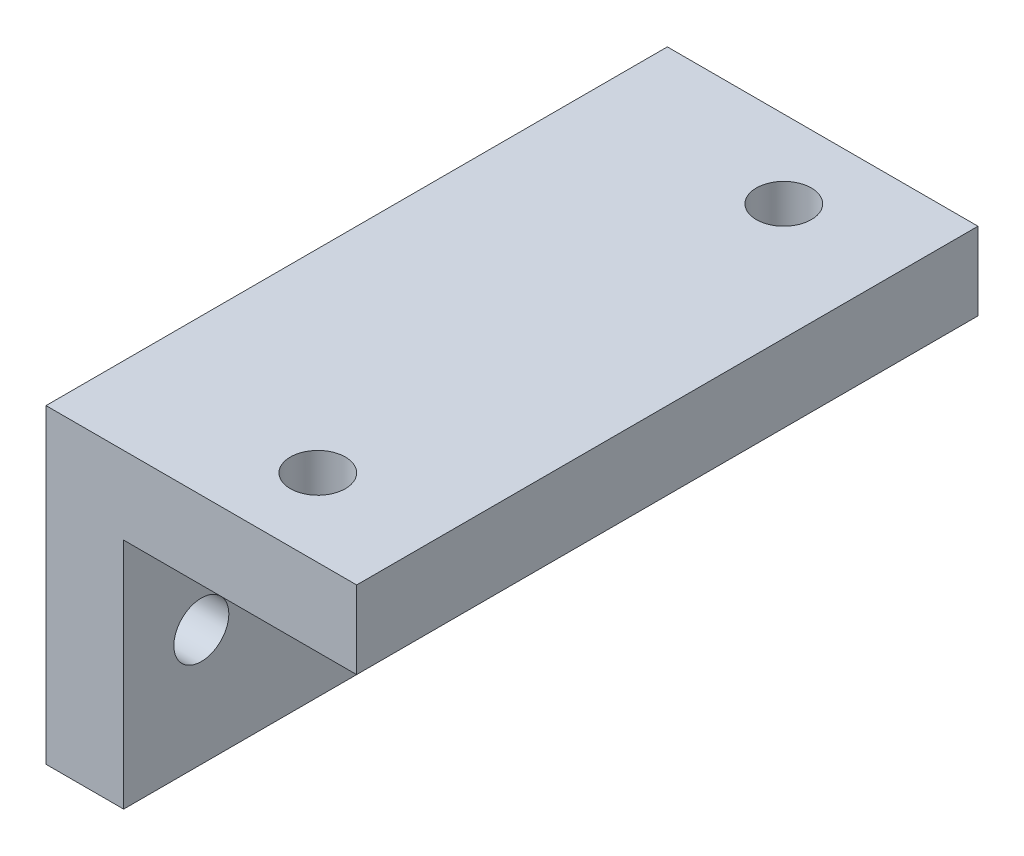
ISO-10303-21;
HEADER;
FILE_DESCRIPTION(('STEP AP214'),'2;1');
FILE_NAME('part.step','',(''),(''),'','','');
FILE_SCHEMA(('AUTOMOTIVE_DESIGN { 1 0 10303 214 1 1 1 1 }'));
ENDSEC;
DATA;
#1=APPLICATION_CONTEXT('core data for automotive mechanical design processes');
#2=APPLICATION_PROTOCOL_DEFINITION('international standard','automotive_design',2000,#1);
#3=PRODUCT_CONTEXT('',#1,'mechanical');
#4=PRODUCT('Part','Part','',(#3));
#5=PRODUCT_RELATED_PRODUCT_CATEGORY('part','',(#4));
#6=PRODUCT_DEFINITION_FORMATION('','',#4);
#7=PRODUCT_DEFINITION_CONTEXT('part definition',#1,'design');
#8=PRODUCT_DEFINITION('design','',#6,#7);
#9=PRODUCT_DEFINITION_SHAPE('','',#8);
#10=(LENGTH_UNIT() NAMED_UNIT(*) SI_UNIT(.MILLI.,.METRE.));
#11=(NAMED_UNIT(*) PLANE_ANGLE_UNIT() SI_UNIT($,.RADIAN.));
#12=(NAMED_UNIT(*) SI_UNIT($,.STERADIAN.) SOLID_ANGLE_UNIT());
#13=UNCERTAINTY_MEASURE_WITH_UNIT(LENGTH_MEASURE(1.E-05),#10,'distance_accuracy_value','');
#14=(GEOMETRIC_REPRESENTATION_CONTEXT(3) GLOBAL_UNCERTAINTY_ASSIGNED_CONTEXT((#13)) GLOBAL_UNIT_ASSIGNED_CONTEXT((#10,
#11,#12)) REPRESENTATION_CONTEXT('',''));
#15=CARTESIAN_POINT('',(0.,0.,0.));
#16=DIRECTION('',(0.,0.,1.));
#17=DIRECTION('',(1.,0.,0.));
#18=AXIS2_PLACEMENT_3D('',#15,#16,#17);
#19=CARTESIAN_POINT('',(0.,0.,25.4));
#20=DIRECTION('',(0.,1.,0.));
#21=DIRECTION('',(0.,0.,1.));
#22=AXIS2_PLACEMENT_3D('',#19,#20,#21);
#23=PLANE('',#22);
#24=DIRECTION('',(1.,0.,0.));
#25=VECTOR('',#24,1.);
#26=CARTESIAN_POINT('',(0.,0.,-25.4));
#27=LINE('',#26,#25);
#28=CARTESIAN_POINT('',(0.,0.,-25.4));
#29=VERTEX_POINT('',#28);
#30=CARTESIAN_POINT('',(19.05,0.,-25.4));
#31=VERTEX_POINT('',#30);
#32=EDGE_CURVE('E121',#29,#31,#27,.T.);
#33=ORIENTED_EDGE('',*,*,#32,.T.);
#34=DIRECTION('',(0.,0.,-1.));
#35=VECTOR('',#34,1.);
#36=CARTESIAN_POINT('',(19.05,0.,25.4));
#37=LINE('',#36,#35);
#38=CARTESIAN_POINT('',(19.05,0.,25.4));
#39=VERTEX_POINT('',#38);
#40=EDGE_CURVE('E42',#39,#31,#37,.T.);
#41=ORIENTED_EDGE('',*,*,#40,.F.);
#42=DIRECTION('',(1.,0.,0.));
#43=VECTOR('',#42,1.);
#44=CARTESIAN_POINT('',(0.,0.,25.4));
#45=LINE('',#44,#43);
#46=CARTESIAN_POINT('',(0.,0.,25.4));
#47=VERTEX_POINT('',#46);
#48=EDGE_CURVE('E87',#47,#39,#45,.T.);
#49=ORIENTED_EDGE('',*,*,#48,.F.);
#50=DIRECTION('',(0.,0.,-1.));
#51=VECTOR('',#50,1.);
#52=CARTESIAN_POINT('',(0.,0.,25.4));
#53=LINE('',#52,#51);
#54=EDGE_CURVE('E11',#47,#29,#53,.T.);
#55=ORIENTED_EDGE('',*,*,#54,.T.);
#56=EDGE_LOOP('',(#33,#41,#49,#55));
#57=FACE_BOUND('',#56,.T.);
#58=CARTESIAN_POINT('',(9.52500000000001,0.,-19.05));
#59=DIRECTION('',(0.,-1.,0.));
#60=DIRECTION('',(0.,0.,-1.));
#61=AXIS2_PLACEMENT_3D('',#58,#59,#60);
#62=CIRCLE('',#61,2.2479);
#63=CARTESIAN_POINT('',(9.52500000000001,0.,-21.2979));
#64=VERTEX_POINT('',#63);
#65=EDGE_CURVE('E173',#64,#64,#62,.T.);
#66=ORIENTED_EDGE('',*,*,#65,.F.);
#67=EDGE_LOOP('',(#66));
#68=FACE_BOUND('',#67,.T.);
#69=CARTESIAN_POINT('',(9.525,0.,19.05));
#70=DIRECTION('',(0.,-1.,0.));
#71=DIRECTION('',(0.,0.,-1.));
#72=AXIS2_PLACEMENT_3D('',#69,#70,#71);
#73=CIRCLE('',#72,2.2479);
#74=CARTESIAN_POINT('',(9.525,0.,16.8021));
#75=VERTEX_POINT('',#74);
#76=EDGE_CURVE('E181',#75,#75,#73,.T.);
#77=ORIENTED_EDGE('',*,*,#76,.F.);
#78=EDGE_LOOP('',(#77));
#79=FACE_BOUND('',#78,.T.);
#80=ADVANCED_FACE('F33',(#57,#68,#79),#23,.F.);
#81=CARTESIAN_POINT('',(0.,-19.05,25.4));
#82=DIRECTION('',(-1.,0.,0.));
#83=DIRECTION('',(0.,-1.,0.));
#84=AXIS2_PLACEMENT_3D('',#81,#82,#83);
#85=PLANE('',#84);
#86=CARTESIAN_POINT('',(0.,-9.525,-19.05));
#87=DIRECTION('',(1.,0.,0.));
#88=DIRECTION('',(0.,0.,-1.));
#89=AXIS2_PLACEMENT_3D('',#86,#87,#88);
#90=CIRCLE('',#89,2.2479);
#91=CARTESIAN_POINT('',(0.,-9.525,-21.2979));
#92=VERTEX_POINT('',#91);
#93=EDGE_CURVE('E193',#92,#92,#90,.T.);
#94=ORIENTED_EDGE('',*,*,#93,.F.);
#95=EDGE_LOOP('',(#94));
#96=FACE_BOUND('',#95,.T.);
#97=CARTESIAN_POINT('',(0.,-9.525,19.05));
#98=DIRECTION('',(1.,0.,0.));
#99=DIRECTION('',(0.,0.,-1.));
#100=AXIS2_PLACEMENT_3D('',#97,#98,#99);
#101=CIRCLE('',#100,2.2479);
#102=CARTESIAN_POINT('',(0.,-9.525,16.8021));
#103=VERTEX_POINT('',#102);
#104=EDGE_CURVE('E187',#103,#103,#101,.T.);
#105=ORIENTED_EDGE('',*,*,#104,.F.);
#106=EDGE_LOOP('',(#105));
#107=FACE_BOUND('',#106,.T.);
#108=DIRECTION('',(0.,1.,0.));
#109=VECTOR('',#108,1.);
#110=CARTESIAN_POINT('',(0.,-19.05,-25.4));
#111=LINE('',#110,#109);
#112=CARTESIAN_POINT('',(0.,-19.05,-25.4));
#113=VERTEX_POINT('',#112);
#114=EDGE_CURVE('E118',#113,#29,#111,.T.);
#115=ORIENTED_EDGE('',*,*,#114,.T.);
#116=ORIENTED_EDGE('',*,*,#54,.F.);
#117=DIRECTION('',(0.,1.,0.));
#118=VECTOR('',#117,1.);
#119=CARTESIAN_POINT('',(0.,-19.05,25.4));
#120=LINE('',#119,#118);
#121=CARTESIAN_POINT('',(0.,-19.05,25.4));
#122=VERTEX_POINT('',#121);
#123=EDGE_CURVE('E129',#122,#47,#120,.T.);
#124=ORIENTED_EDGE('',*,*,#123,.F.);
#125=DIRECTION('',(0.,0.,-1.));
#126=VECTOR('',#125,1.);
#127=CARTESIAN_POINT('',(0.,-19.05,25.4));
#128=LINE('',#127,#126);
#129=EDGE_CURVE('E114',#122,#113,#128,.T.);
#130=ORIENTED_EDGE('',*,*,#129,.T.);
#131=EDGE_LOOP('',(#115,#116,#124,#130));
#132=FACE_BOUND('',#131,.T.);
#133=ADVANCED_FACE('F35',(#96,#107,#132),#85,.F.);
#134=CARTESIAN_POINT('',(19.05,0.,25.4));
#135=DIRECTION('',(-1.,0.,0.));
#136=DIRECTION('',(0.,0.,1.));
#137=AXIS2_PLACEMENT_3D('',#134,#135,#136);
#138=PLANE('',#137);
#139=DIRECTION('',(0.,1.,0.));
#140=VECTOR('',#139,1.);
#141=CARTESIAN_POINT('',(19.05,0.,-25.4));
#142=LINE('',#141,#140);
#143=CARTESIAN_POINT('',(19.05,6.34999999999999,-25.4));
#144=VERTEX_POINT('',#143);
#145=EDGE_CURVE('E124',#31,#144,#142,.T.);
#146=ORIENTED_EDGE('',*,*,#145,.T.);
#147=DIRECTION('',(0.,0.,-1.));
#148=VECTOR('',#147,1.);
#149=CARTESIAN_POINT('',(19.05,6.34999999999999,25.4));
#150=LINE('',#149,#148);
#151=CARTESIAN_POINT('',(19.05,6.34999999999999,25.4));
#152=VERTEX_POINT('',#151);
#153=EDGE_CURVE('E109',#152,#144,#150,.T.);
#154=ORIENTED_EDGE('',*,*,#153,.F.);
#155=DIRECTION('',(0.,1.,0.));
#156=VECTOR('',#155,1.);
#157=CARTESIAN_POINT('',(19.05,0.,25.4));
#158=LINE('',#157,#156);
#159=EDGE_CURVE('E100',#39,#152,#158,.T.);
#160=ORIENTED_EDGE('',*,*,#159,.F.);
#161=ORIENTED_EDGE('',*,*,#40,.T.);
#162=EDGE_LOOP('',(#146,#154,#160,#161));
#163=FACE_BOUND('',#162,.T.);
#164=ADVANCED_FACE('F135',(#163),#138,.F.);
#165=CARTESIAN_POINT('',(19.05,6.34999999999999,25.4));
#166=DIRECTION('',(0.,-1.,0.));
#167=DIRECTION('',(1.,0.,0.));
#168=AXIS2_PLACEMENT_3D('',#165,#166,#167);
#169=PLANE('',#168);
#170=CARTESIAN_POINT('',(9.525,6.35,19.05));
#171=DIRECTION('',(0.,-1.,0.));
#172=DIRECTION('',(1.,0.,0.));
#173=AXIS2_PLACEMENT_3D('',#170,#171,#172);
#174=CIRCLE('',#173,2.2479);
#175=CARTESIAN_POINT('',(11.7729,6.35,19.05));
#176=VERTEX_POINT('',#175);
#177=EDGE_CURVE('E169',#176,#176,#174,.T.);
#178=ORIENTED_EDGE('',*,*,#177,.T.);
#179=EDGE_LOOP('',(#178));
#180=FACE_BOUND('',#179,.T.);
#181=CARTESIAN_POINT('',(9.52500000000001,6.35,-19.05));
#182=DIRECTION('',(0.,-1.,0.));
#183=DIRECTION('',(1.,0.,0.));
#184=AXIS2_PLACEMENT_3D('',#181,#182,#183);
#185=CIRCLE('',#184,2.2479);
#186=CARTESIAN_POINT('',(11.7729,6.35,-19.05));
#187=VERTEX_POINT('',#186);
#188=EDGE_CURVE('E122',#187,#187,#185,.T.);
#189=ORIENTED_EDGE('',*,*,#188,.T.);
#190=EDGE_LOOP('',(#189));
#191=FACE_BOUND('',#190,.T.);
#192=DIRECTION('',(-1.,0.,0.));
#193=VECTOR('',#192,1.);
#194=CARTESIAN_POINT('',(19.05,6.34999999999999,-25.4));
#195=LINE('',#194,#193);
#196=CARTESIAN_POINT('',(-6.35000000000001,6.35,-25.4));
#197=VERTEX_POINT('',#196);
#198=EDGE_CURVE('E108',#144,#197,#195,.T.);
#199=ORIENTED_EDGE('',*,*,#198,.T.);
#200=DIRECTION('',(0.,0.,-1.));
#201=VECTOR('',#200,1.);
#202=CARTESIAN_POINT('',(-6.35000000000001,6.35,25.4));
#203=LINE('',#202,#201);
#204=CARTESIAN_POINT('',(-6.35000000000001,6.35,25.4));
#205=VERTEX_POINT('',#204);
#206=EDGE_CURVE('E105',#205,#197,#203,.T.);
#207=ORIENTED_EDGE('',*,*,#206,.F.);
#208=DIRECTION('',(-1.,0.,0.));
#209=VECTOR('',#208,1.);
#210=CARTESIAN_POINT('',(19.05,6.34999999999999,25.4));
#211=LINE('',#210,#209);
#212=EDGE_CURVE('E94',#152,#205,#211,.T.);
#213=ORIENTED_EDGE('',*,*,#212,.F.);
#214=ORIENTED_EDGE('',*,*,#153,.T.);
#215=EDGE_LOOP('',(#199,#207,#213,#214));
#216=FACE_BOUND('',#215,.T.);
#217=ADVANCED_FACE('F106',(#180,#191,#216),#169,.F.);
#218=CARTESIAN_POINT('',(-6.35000000000001,6.35,25.4));
#219=DIRECTION('',(1.,0.,0.));
#220=DIRECTION('',(0.,1.,0.));
#221=AXIS2_PLACEMENT_3D('',#218,#219,#220);
#222=PLANE('',#221);
#223=CARTESIAN_POINT('',(-6.35,-9.525,-19.05));
#224=DIRECTION('',(1.,0.,0.));
#225=DIRECTION('',(0.,0.,-1.));
#226=AXIS2_PLACEMENT_3D('',#223,#224,#225);
#227=CIRCLE('',#226,2.2479);
#228=CARTESIAN_POINT('',(-6.35,-9.525,-21.2979));
#229=VERTEX_POINT('',#228);
#230=EDGE_CURVE('E190',#229,#229,#227,.T.);
#231=ORIENTED_EDGE('',*,*,#230,.T.);
#232=EDGE_LOOP('',(#231));
#233=FACE_BOUND('',#232,.T.);
#234=CARTESIAN_POINT('',(-6.35,-9.525,19.05));
#235=DIRECTION('',(1.,0.,0.));
#236=DIRECTION('',(0.,0.,-1.));
#237=AXIS2_PLACEMENT_3D('',#234,#235,#236);
#238=CIRCLE('',#237,2.2479);
#239=CARTESIAN_POINT('',(-6.35,-9.525,16.8021));
#240=VERTEX_POINT('',#239);
#241=EDGE_CURVE('E184',#240,#240,#238,.T.);
#242=ORIENTED_EDGE('',*,*,#241,.T.);
#243=EDGE_LOOP('',(#242));
#244=FACE_BOUND('',#243,.T.);
#245=DIRECTION('',(0.,-1.,0.));
#246=VECTOR('',#245,1.);
#247=CARTESIAN_POINT('',(-6.35000000000001,6.35,-25.4));
#248=LINE('',#247,#246);
#249=CARTESIAN_POINT('',(-6.35,-19.05,-25.4));
#250=VERTEX_POINT('',#249);
#251=EDGE_CURVE('E73',#197,#250,#248,.T.);
#252=ORIENTED_EDGE('',*,*,#251,.T.);
#253=DIRECTION('',(0.,0.,-1.));
#254=VECTOR('',#253,1.);
#255=CARTESIAN_POINT('',(-6.35,-19.05,25.4));
#256=LINE('',#255,#254);
#257=CARTESIAN_POINT('',(-6.35,-19.05,25.4));
#258=VERTEX_POINT('',#257);
#259=EDGE_CURVE('E110',#258,#250,#256,.T.);
#260=ORIENTED_EDGE('',*,*,#259,.F.);
#261=DIRECTION('',(0.,-1.,0.));
#262=VECTOR('',#261,1.);
#263=CARTESIAN_POINT('',(-6.35000000000001,6.35,25.4));
#264=LINE('',#263,#262);
#265=EDGE_CURVE('E98',#205,#258,#264,.T.);
#266=ORIENTED_EDGE('',*,*,#265,.F.);
#267=ORIENTED_EDGE('',*,*,#206,.T.);
#268=EDGE_LOOP('',(#252,#260,#266,#267));
#269=FACE_BOUND('',#268,.T.);
#270=ADVANCED_FACE('F112',(#233,#244,#269),#222,.F.);
#271=CARTESIAN_POINT('',(-6.35,-19.05,25.4));
#272=DIRECTION('',(0.,1.,0.));
#273=DIRECTION('',(0.,0.,1.));
#274=AXIS2_PLACEMENT_3D('',#271,#272,#273);
#275=PLANE('',#274);
#276=DIRECTION('',(1.,0.,0.));
#277=VECTOR('',#276,1.);
#278=CARTESIAN_POINT('',(-6.35,-19.05,-25.4));
#279=LINE('',#278,#277);
#280=EDGE_CURVE('E79',#250,#113,#279,.T.);
#281=ORIENTED_EDGE('',*,*,#280,.T.);
#282=ORIENTED_EDGE('',*,*,#129,.F.);
#283=DIRECTION('',(1.,0.,0.));
#284=VECTOR('',#283,1.);
#285=CARTESIAN_POINT('',(-6.35,-19.05,25.4));
#286=LINE('',#285,#284);
#287=EDGE_CURVE('E50',#258,#122,#286,.T.);
#288=ORIENTED_EDGE('',*,*,#287,.F.);
#289=ORIENTED_EDGE('',*,*,#259,.T.);
#290=EDGE_LOOP('',(#281,#282,#288,#289));
#291=FACE_BOUND('',#290,.T.);
#292=ADVANCED_FACE('F142',(#291),#275,.F.);
#293=CARTESIAN_POINT('',(0.,0.,25.4));
#294=DIRECTION('',(0.,0.,-1.));
#295=DIRECTION('',(-1.,0.,0.));
#296=AXIS2_PLACEMENT_3D('',#293,#294,#295);
#297=PLANE('',#296);
#298=ORIENTED_EDGE('',*,*,#123,.T.);
#299=ORIENTED_EDGE('',*,*,#48,.T.);
#300=ORIENTED_EDGE('',*,*,#159,.T.);
#301=ORIENTED_EDGE('',*,*,#212,.T.);
#302=ORIENTED_EDGE('',*,*,#265,.T.);
#303=ORIENTED_EDGE('',*,*,#287,.T.);
#304=EDGE_LOOP('',(#298,#299,#300,#301,#302,#303));
#305=FACE_BOUND('',#304,.T.);
#306=ADVANCED_FACE('F96',(#305),#297,.F.);
#307=CARTESIAN_POINT('',(0.,0.,-25.4));
#308=DIRECTION('',(0.,0.,-1.));
#309=DIRECTION('',(-1.,0.,0.));
#310=AXIS2_PLACEMENT_3D('',#307,#308,#309);
#311=PLANE('',#310);
#312=ORIENTED_EDGE('',*,*,#114,.F.);
#313=ORIENTED_EDGE('',*,*,#280,.F.);
#314=ORIENTED_EDGE('',*,*,#251,.F.);
#315=ORIENTED_EDGE('',*,*,#198,.F.);
#316=ORIENTED_EDGE('',*,*,#145,.F.);
#317=ORIENTED_EDGE('',*,*,#32,.F.);
#318=EDGE_LOOP('',(#312,#313,#314,#315,#316,#317));
#319=FACE_BOUND('',#318,.T.);
#320=ADVANCED_FACE('F138',(#319),#311,.T.);
#321=CARTESIAN_POINT('',(9.52500000000001,0.,-19.05));
#322=DIRECTION('',(0.,-1.,0.));
#323=DIRECTION('',(0.,0.,-1.));
#324=AXIS2_PLACEMENT_3D('',#321,#322,#323);
#325=CYLINDRICAL_SURFACE('',#324,2.2479);
#326=ORIENTED_EDGE('',*,*,#188,.F.);
#327=EDGE_LOOP('',(#326));
#328=FACE_BOUND('',#327,.T.);
#329=ORIENTED_EDGE('',*,*,#65,.T.);
#330=EDGE_LOOP('',(#329));
#331=FACE_BOUND('',#330,.T.);
#332=ADVANCED_FACE('F212',(#328,#331),#325,.F.);
#333=CARTESIAN_POINT('',(9.525,0.,19.05));
#334=DIRECTION('',(0.,-1.,0.));
#335=DIRECTION('',(0.,0.,-1.));
#336=AXIS2_PLACEMENT_3D('',#333,#334,#335);
#337=CYLINDRICAL_SURFACE('',#336,2.2479);
#338=ORIENTED_EDGE('',*,*,#177,.F.);
#339=EDGE_LOOP('',(#338));
#340=FACE_BOUND('',#339,.T.);
#341=ORIENTED_EDGE('',*,*,#76,.T.);
#342=EDGE_LOOP('',(#341));
#343=FACE_BOUND('',#342,.T.);
#344=ADVANCED_FACE('F203',(#340,#343),#337,.F.);
#345=CARTESIAN_POINT('',(0.,-9.525,19.05));
#346=DIRECTION('',(1.,0.,0.));
#347=DIRECTION('',(0.,0.,-1.));
#348=AXIS2_PLACEMENT_3D('',#345,#346,#347);
#349=CYLINDRICAL_SURFACE('',#348,2.2479);
#350=ORIENTED_EDGE('',*,*,#241,.F.);
#351=EDGE_LOOP('',(#350));
#352=FACE_BOUND('',#351,.T.);
#353=ORIENTED_EDGE('',*,*,#104,.T.);
#354=EDGE_LOOP('',(#353));
#355=FACE_BOUND('',#354,.T.);
#356=ADVANCED_FACE('F201',(#352,#355),#349,.F.);
#357=CARTESIAN_POINT('',(0.,-9.525,-19.05));
#358=DIRECTION('',(1.,0.,0.));
#359=DIRECTION('',(0.,0.,-1.));
#360=AXIS2_PLACEMENT_3D('',#357,#358,#359);
#361=CYLINDRICAL_SURFACE('',#360,2.2479);
#362=ORIENTED_EDGE('',*,*,#230,.F.);
#363=EDGE_LOOP('',(#362));
#364=FACE_BOUND('',#363,.T.);
#365=ORIENTED_EDGE('',*,*,#93,.T.);
#366=EDGE_LOOP('',(#365));
#367=FACE_BOUND('',#366,.T.);
#368=ADVANCED_FACE('F197',(#364,#367),#361,.F.);
#369=CLOSED_SHELL('',(#80,#133,#164,#217,#270,#292,#306,#320,#332,#344,#356,#368));
#370=MANIFOLD_SOLID_BREP('B2',#369);
#371=ADVANCED_BREP_SHAPE_REPRESENTATION('',(#18,#370),#14);
#372=SHAPE_DEFINITION_REPRESENTATION(#9,#371);
ENDSEC;
END-ISO-10303-21;
